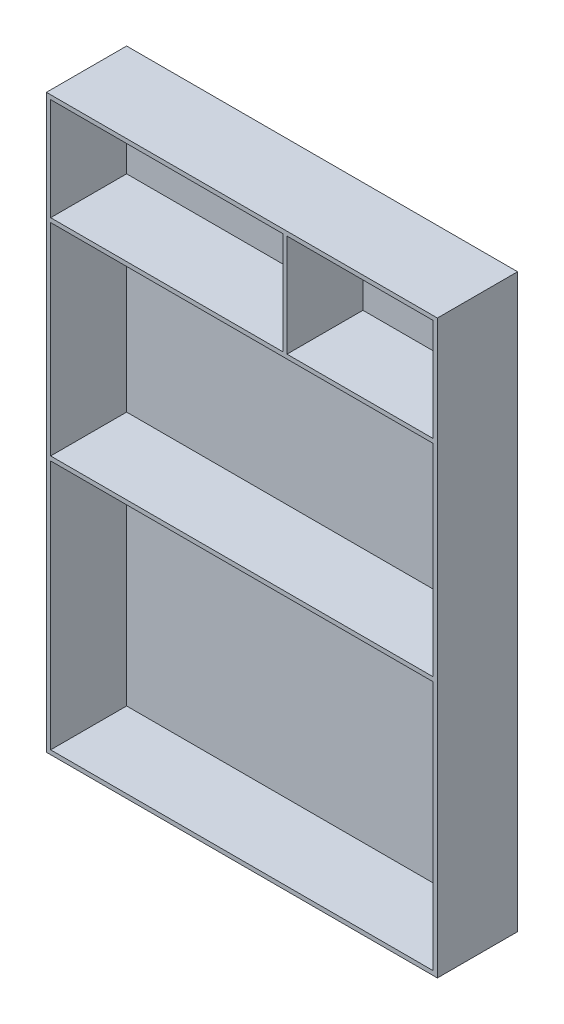
ISO-10303-21;
HEADER;
FILE_DESCRIPTION(('STEP AP214'),'2;1');
FILE_NAME('part.step','',(''),(''),'','','');
FILE_SCHEMA(('AUTOMOTIVE_DESIGN { 1 0 10303 214 1 1 1 1 }'));
ENDSEC;
DATA;
#1=APPLICATION_CONTEXT('core data for automotive mechanical design processes');
#2=APPLICATION_PROTOCOL_DEFINITION('international standard','automotive_design',2000,#1);
#3=PRODUCT_CONTEXT('',#1,'mechanical');
#4=PRODUCT('Part','Part','',(#3));
#5=PRODUCT_RELATED_PRODUCT_CATEGORY('part','',(#4));
#6=PRODUCT_DEFINITION_FORMATION('','',#4);
#7=PRODUCT_DEFINITION_CONTEXT('part definition',#1,'design');
#8=PRODUCT_DEFINITION('design','',#6,#7);
#9=PRODUCT_DEFINITION_SHAPE('','',#8);
#10=(LENGTH_UNIT() NAMED_UNIT(*) SI_UNIT(.MILLI.,.METRE.));
#11=(NAMED_UNIT(*) PLANE_ANGLE_UNIT() SI_UNIT($,.RADIAN.));
#12=(NAMED_UNIT(*) SI_UNIT($,.STERADIAN.) SOLID_ANGLE_UNIT());
#13=UNCERTAINTY_MEASURE_WITH_UNIT(LENGTH_MEASURE(1.E-05),#10,'distance_accuracy_value','');
#14=(GEOMETRIC_REPRESENTATION_CONTEXT(3) GLOBAL_UNCERTAINTY_ASSIGNED_CONTEXT((#13)) GLOBAL_UNIT_ASSIGNED_CONTEXT((#10,
#11,#12)) REPRESENTATION_CONTEXT('',''));
#15=CARTESIAN_POINT('',(0.,0.,0.));
#16=DIRECTION('',(0.,0.,1.));
#17=DIRECTION('',(1.,0.,0.));
#18=AXIS2_PLACEMENT_3D('',#15,#16,#17);
#19=CARTESIAN_POINT('',(135.620852814771,-122.622822103109,45.72));
#20=DIRECTION('',(-1.,0.,0.));
#21=DIRECTION('',(0.,0.,1.));
#22=AXIS2_PLACEMENT_3D('',#19,#20,#21);
#23=PLANE('',#22);
#24=DIRECTION('',(0.,1.,0.));
#25=VECTOR('',#24,1.);
#26=CARTESIAN_POINT('',(135.620852814771,-122.622822103109,0.));
#27=LINE('',#26,#25);
#28=CARTESIAN_POINT('',(135.620852814771,154.74348344851,0.));
#29=VERTEX_POINT('',#28);
#30=CARTESIAN_POINT('',(135.620852814771,216.296497032044,0.));
#31=VERTEX_POINT('',#30);
#32=EDGE_CURVE('E231',#29,#31,#27,.T.);
#33=ORIENTED_EDGE('',*,*,#32,.F.);
#34=DIRECTION('',(0.,0.,-1.));
#35=VECTOR('',#34,1.);
#36=CARTESIAN_POINT('',(135.620852814771,154.74348344851,284.698174658136));
#37=LINE('',#36,#35);
#38=CARTESIAN_POINT('',(135.620852814771,154.74348344851,45.72));
#39=VERTEX_POINT('',#38);
#40=EDGE_CURVE('E217',#39,#29,#37,.T.);
#41=ORIENTED_EDGE('',*,*,#40,.F.);
#42=DIRECTION('',(0.,1.,0.));
#43=VECTOR('',#42,1.);
#44=CARTESIAN_POINT('',(135.620852814771,-122.622822103109,45.72));
#45=LINE('',#44,#43);
#46=CARTESIAN_POINT('',(135.620852814771,216.296497032044,45.72));
#47=VERTEX_POINT('',#46);
#48=EDGE_CURVE('E198',#39,#47,#45,.T.);
#49=ORIENTED_EDGE('',*,*,#48,.T.);
#50=DIRECTION('',(0.,0.,-1.));
#51=VECTOR('',#50,1.);
#52=CARTESIAN_POINT('',(135.620852814771,216.296497032044,45.72));
#53=LINE('',#52,#51);
#54=EDGE_CURVE('E277',#47,#31,#53,.T.);
#55=ORIENTED_EDGE('',*,*,#54,.T.);
#56=EDGE_LOOP('',(#33,#41,#49,#55));
#57=FACE_BOUND('',#56,.T.);
#58=ADVANCED_FACE('F36',(#57),#23,.T.);
#59=CARTESIAN_POINT('',(135.620852814771,30.5575563562701,45.72));
#60=VERTEX_POINT('',#59);
#61=CARTESIAN_POINT('',(135.620852814771,152.20348344851,45.72));
#62=VERTEX_POINT('',#61);
#63=EDGE_CURVE('E246',#60,#62,#45,.T.);
#64=ORIENTED_EDGE('',*,*,#63,.T.);
#65=DIRECTION('',(0.,0.,-1.));
#66=VECTOR('',#65,1.);
#67=CARTESIAN_POINT('',(135.620852814771,152.20348344851,284.698174658136));
#68=LINE('',#67,#66);
#69=CARTESIAN_POINT('',(135.620852814771,152.20348344851,0.));
#70=VERTEX_POINT('',#69);
#71=EDGE_CURVE('E199',#62,#70,#68,.T.);
#72=ORIENTED_EDGE('',*,*,#71,.T.);
#73=CARTESIAN_POINT('',(135.620852814771,30.5575563562701,0.));
#74=VERTEX_POINT('',#73);
#75=EDGE_CURVE('E260',#74,#70,#27,.T.);
#76=ORIENTED_EDGE('',*,*,#75,.F.);
#77=DIRECTION('',(0.,0.,-1.));
#78=VECTOR('',#77,1.);
#79=CARTESIAN_POINT('',(135.620852814771,30.5575563562701,284.698174658136));
#80=LINE('',#79,#78);
#81=EDGE_CURVE('E223',#60,#74,#80,.T.);
#82=ORIENTED_EDGE('',*,*,#81,.F.);
#83=EDGE_LOOP('',(#64,#72,#76,#82));
#84=FACE_BOUND('',#83,.T.);
#85=ADVANCED_FACE('F334',(#84),#23,.T.);
#86=CARTESIAN_POINT('',(-94.6021989691793,-122.622822103109,45.72));
#87=DIRECTION('',(1.,0.,0.));
#88=DIRECTION('',(0.,0.,-1.));
#89=AXIS2_PLACEMENT_3D('',#86,#87,#88);
#90=PLANE('',#89);
#91=DIRECTION('',(0.,-1.,0.));
#92=VECTOR('',#91,1.);
#93=CARTESIAN_POINT('',(-94.6021989691793,-122.622822103109,45.72));
#94=LINE('',#93,#92);
#95=CARTESIAN_POINT('',(-94.6021989691793,216.296497032044,45.72));
#96=VERTEX_POINT('',#95);
#97=CARTESIAN_POINT('',(-94.6021989691793,154.74348344851,45.72));
#98=VERTEX_POINT('',#97);
#99=EDGE_CURVE('E250',#96,#98,#94,.T.);
#100=ORIENTED_EDGE('',*,*,#99,.T.);
#101=DIRECTION('',(0.,0.,-1.));
#102=VECTOR('',#101,1.);
#103=CARTESIAN_POINT('',(-94.6021989691793,154.74348344851,284.698174658136));
#104=LINE('',#103,#102);
#105=CARTESIAN_POINT('',(-94.6021989691793,154.74348344851,0.));
#106=VERTEX_POINT('',#105);
#107=EDGE_CURVE('E212',#98,#106,#104,.T.);
#108=ORIENTED_EDGE('',*,*,#107,.T.);
#109=DIRECTION('',(0.,-1.,0.));
#110=VECTOR('',#109,1.);
#111=CARTESIAN_POINT('',(-94.6021989691793,-122.622822103109,0.));
#112=LINE('',#111,#110);
#113=CARTESIAN_POINT('',(-94.6021989691793,216.296497032044,0.));
#114=VERTEX_POINT('',#113);
#115=EDGE_CURVE('E264',#114,#106,#112,.T.);
#116=ORIENTED_EDGE('',*,*,#115,.F.);
#117=DIRECTION('',(0.,0.,-1.));
#118=VECTOR('',#117,1.);
#119=CARTESIAN_POINT('',(-94.6021989691793,216.296497032044,45.72));
#120=LINE('',#119,#118);
#121=EDGE_CURVE('E274',#96,#114,#120,.T.);
#122=ORIENTED_EDGE('',*,*,#121,.F.);
#123=EDGE_LOOP('',(#100,#108,#116,#122));
#124=FACE_BOUND('',#123,.T.);
#125=ADVANCED_FACE('F341',(#124),#90,.T.);
#126=CARTESIAN_POINT('',(-94.6021989691793,152.20348344851,0.));
#127=VERTEX_POINT('',#126);
#128=CARTESIAN_POINT('',(-94.6021989691793,30.5575563562701,0.));
#129=VERTEX_POINT('',#128);
#130=EDGE_CURVE('E267',#127,#129,#112,.T.);
#131=ORIENTED_EDGE('',*,*,#130,.F.);
#132=DIRECTION('',(0.,0.,-1.));
#133=VECTOR('',#132,1.);
#134=CARTESIAN_POINT('',(-94.6021989691793,152.20348344851,284.698174658136));
#135=LINE('',#134,#133);
#136=CARTESIAN_POINT('',(-94.6021989691793,152.20348344851,45.72));
#137=VERTEX_POINT('',#136);
#138=EDGE_CURVE('E214',#137,#127,#135,.T.);
#139=ORIENTED_EDGE('',*,*,#138,.F.);
#140=CARTESIAN_POINT('',(-94.6021989691793,30.5575563562701,45.72));
#141=VERTEX_POINT('',#140);
#142=EDGE_CURVE('E253',#137,#141,#94,.T.);
#143=ORIENTED_EDGE('',*,*,#142,.T.);
#144=DIRECTION('',(0.,0.,-1.));
#145=VECTOR('',#144,1.);
#146=CARTESIAN_POINT('',(-94.6021989691793,30.5575563562701,284.698174658136));
#147=LINE('',#146,#145);
#148=EDGE_CURVE('E222',#141,#129,#147,.T.);
#149=ORIENTED_EDGE('',*,*,#148,.T.);
#150=EDGE_LOOP('',(#131,#139,#143,#149));
#151=FACE_BOUND('',#150,.T.);
#152=ADVANCED_FACE('F356',(#151),#90,.T.);
#153=CARTESIAN_POINT('',(0.,0.,0.));
#154=DIRECTION('',(0.,0.,1.));
#155=DIRECTION('',(1.,0.,0.));
#156=AXIS2_PLACEMENT_3D('',#153,#154,#155);
#157=PLANE('',#156);
#158=DIRECTION('',(0.,1.,0.));
#159=VECTOR('',#158,1.);
#160=CARTESIAN_POINT('',(47.6378010308207,154.74348344851,0.));
#161=LINE('',#160,#159);
#162=CARTESIAN_POINT('',(47.6378010308207,154.74348344851,0.));
#163=VERTEX_POINT('',#162);
#164=CARTESIAN_POINT('',(47.6378010308207,216.296497032044,0.));
#165=VERTEX_POINT('',#164);
#166=EDGE_CURVE('E53',#163,#165,#161,.T.);
#167=ORIENTED_EDGE('',*,*,#166,.F.);
#168=DIRECTION('',(-1.,0.,0.));
#169=VECTOR('',#168,1.);
#170=CARTESIAN_POINT('',(135.620852814771,154.74348344851,0.));
#171=LINE('',#170,#169);
#172=EDGE_CURVE('E193',#29,#163,#171,.T.);
#173=ORIENTED_EDGE('',*,*,#172,.F.);
#174=ORIENTED_EDGE('',*,*,#32,.T.);
#175=DIRECTION('',(-1.,0.,0.));
#176=VECTOR('',#175,1.);
#177=CARTESIAN_POINT('',(135.620852814771,216.296497032044,0.));
#178=LINE('',#177,#176);
#179=EDGE_CURVE('E261',#31,#165,#178,.T.);
#180=ORIENTED_EDGE('',*,*,#179,.T.);
#181=EDGE_LOOP('',(#167,#173,#174,#180));
#182=FACE_BOUND('',#181,.T.);
#183=ADVANCED_FACE('F417',(#182),#157,.T.);
#184=DIRECTION('',(-1.,0.,0.));
#185=VECTOR('',#184,1.);
#186=CARTESIAN_POINT('',(45.0978010308207,154.74348344851,0.));
#187=LINE('',#186,#185);
#188=CARTESIAN_POINT('',(45.0978010308207,154.74348344851,0.));
#189=VERTEX_POINT('',#188);
#190=EDGE_CURVE('E61',#189,#106,#187,.T.);
#191=ORIENTED_EDGE('',*,*,#190,.F.);
#192=DIRECTION('',(0.,-1.,0.));
#193=VECTOR('',#192,1.);
#194=CARTESIAN_POINT('',(45.0978010308207,216.296497032044,0.));
#195=LINE('',#194,#193);
#196=CARTESIAN_POINT('',(45.0978010308207,216.296497032044,0.));
#197=VERTEX_POINT('',#196);
#198=EDGE_CURVE('E209',#197,#189,#195,.T.);
#199=ORIENTED_EDGE('',*,*,#198,.F.);
#200=EDGE_CURVE('E259',#197,#114,#178,.T.);
#201=ORIENTED_EDGE('',*,*,#200,.T.);
#202=ORIENTED_EDGE('',*,*,#115,.T.);
#203=EDGE_LOOP('',(#191,#199,#201,#202));
#204=FACE_BOUND('',#203,.T.);
#205=ADVANCED_FACE('F411',(#204),#157,.T.);
#206=ORIENTED_EDGE('',*,*,#75,.T.);
#207=DIRECTION('',(1.,0.,0.));
#208=VECTOR('',#207,1.);
#209=CARTESIAN_POINT('',(-84.9187900837198,152.20348344851,0.));
#210=LINE('',#209,#208);
#211=EDGE_CURVE('E201',#127,#70,#210,.T.);
#212=ORIENTED_EDGE('',*,*,#211,.F.);
#213=ORIENTED_EDGE('',*,*,#130,.T.);
#214=DIRECTION('',(-1.,0.,0.));
#215=VECTOR('',#214,1.);
#216=CARTESIAN_POINT('',(-94.6021989691793,30.5575563562701,0.));
#217=LINE('',#216,#215);
#218=EDGE_CURVE('E219',#74,#129,#217,.T.);
#219=ORIENTED_EDGE('',*,*,#218,.F.);
#220=EDGE_LOOP('',(#206,#212,#213,#219));
#221=FACE_BOUND('',#220,.T.);
#222=ADVANCED_FACE('F376',(#221),#157,.T.);
#223=CARTESIAN_POINT('',(135.620852814771,216.296497032044,45.72));
#224=DIRECTION('',(0.,-1.,0.));
#225=DIRECTION('',(1.,0.,0.));
#226=AXIS2_PLACEMENT_3D('',#223,#224,#225);
#227=PLANE('',#226);
#228=DIRECTION('',(-1.,0.,0.));
#229=VECTOR('',#228,1.);
#230=CARTESIAN_POINT('',(135.620852814771,216.296497032044,45.72));
#231=LINE('',#230,#229);
#232=CARTESIAN_POINT('',(47.6378010308207,216.296497032044,45.72));
#233=VERTEX_POINT('',#232);
#234=EDGE_CURVE('E247',#47,#233,#231,.T.);
#235=ORIENTED_EDGE('',*,*,#234,.T.);
#236=DIRECTION('',(0.,0.,-1.));
#237=VECTOR('',#236,1.);
#238=CARTESIAN_POINT('',(47.6378010308207,216.296497032044,284.698174658136));
#239=LINE('',#238,#237);
#240=EDGE_CURVE('E182',#233,#165,#239,.T.);
#241=ORIENTED_EDGE('',*,*,#240,.T.);
#242=ORIENTED_EDGE('',*,*,#179,.F.);
#243=ORIENTED_EDGE('',*,*,#54,.F.);
#244=EDGE_LOOP('',(#235,#241,#242,#243));
#245=FACE_BOUND('',#244,.T.);
#246=ADVANCED_FACE('F357',(#245),#227,.T.);
#247=ORIENTED_EDGE('',*,*,#200,.F.);
#248=DIRECTION('',(0.,0.,-1.));
#249=VECTOR('',#248,1.);
#250=CARTESIAN_POINT('',(45.0978010308207,216.296497032044,284.698174658136));
#251=LINE('',#250,#249);
#252=CARTESIAN_POINT('',(45.0978010308207,216.296497032044,45.72));
#253=VERTEX_POINT('',#252);
#254=EDGE_CURVE('E206',#253,#197,#251,.T.);
#255=ORIENTED_EDGE('',*,*,#254,.F.);
#256=EDGE_CURVE('E245',#253,#96,#231,.T.);
#257=ORIENTED_EDGE('',*,*,#256,.T.);
#258=ORIENTED_EDGE('',*,*,#121,.T.);
#259=EDGE_LOOP('',(#247,#255,#257,#258));
#260=FACE_BOUND('',#259,.T.);
#261=ADVANCED_FACE('F347',(#260),#227,.T.);
#262=CARTESIAN_POINT('',(135.620852814771,-122.622822103109,45.72));
#263=VERTEX_POINT('',#262);
#264=CARTESIAN_POINT('',(135.620852814771,27.9656420980806,45.72));
#265=VERTEX_POINT('',#264);
#266=EDGE_CURVE('E242',#263,#265,#45,.T.);
#267=ORIENTED_EDGE('',*,*,#266,.T.);
#268=DIRECTION('',(0.,0.,-1.));
#269=VECTOR('',#268,1.);
#270=CARTESIAN_POINT('',(135.620852814771,27.9656420980806,284.698174658136));
#271=LINE('',#270,#269);
#272=CARTESIAN_POINT('',(135.620852814771,27.9656420980806,0.));
#273=VERTEX_POINT('',#272);
#274=EDGE_CURVE('E226',#265,#273,#271,.T.);
#275=ORIENTED_EDGE('',*,*,#274,.T.);
#276=CARTESIAN_POINT('',(135.620852814771,-122.622822103109,0.));
#277=VERTEX_POINT('',#276);
#278=EDGE_CURVE('E256',#277,#273,#27,.T.);
#279=ORIENTED_EDGE('',*,*,#278,.F.);
#280=DIRECTION('',(0.,0.,-1.));
#281=VECTOR('',#280,1.);
#282=CARTESIAN_POINT('',(135.620852814771,-122.622822103109,45.72));
#283=LINE('',#282,#281);
#284=EDGE_CURVE('E255',#263,#277,#283,.T.);
#285=ORIENTED_EDGE('',*,*,#284,.F.);
#286=EDGE_LOOP('',(#267,#275,#279,#285));
#287=FACE_BOUND('',#286,.T.);
#288=ADVANCED_FACE('F337',(#287),#23,.T.);
#289=CARTESIAN_POINT('',(-94.6021989691793,27.9656420980806,0.));
#290=VERTEX_POINT('',#289);
#291=CARTESIAN_POINT('',(-94.6021989691793,-122.622822103109,0.));
#292=VERTEX_POINT('',#291);
#293=EDGE_CURVE('E263',#290,#292,#112,.T.);
#294=ORIENTED_EDGE('',*,*,#293,.F.);
#295=DIRECTION('',(0.,0.,-1.));
#296=VECTOR('',#295,1.);
#297=CARTESIAN_POINT('',(-94.6021989691793,27.9656420980806,284.698174658136));
#298=LINE('',#297,#296);
#299=CARTESIAN_POINT('',(-94.6021989691793,27.9656420980806,45.72));
#300=VERTEX_POINT('',#299);
#301=EDGE_CURVE('E227',#300,#290,#298,.T.);
#302=ORIENTED_EDGE('',*,*,#301,.F.);
#303=CARTESIAN_POINT('',(-94.6021989691793,-122.622822103109,45.72));
#304=VERTEX_POINT('',#303);
#305=EDGE_CURVE('E249',#300,#304,#94,.T.);
#306=ORIENTED_EDGE('',*,*,#305,.T.);
#307=DIRECTION('',(0.,0.,-1.));
#308=VECTOR('',#307,1.);
#309=CARTESIAN_POINT('',(-94.6021989691793,-122.622822103109,45.72));
#310=LINE('',#309,#308);
#311=EDGE_CURVE('E271',#304,#292,#310,.T.);
#312=ORIENTED_EDGE('',*,*,#311,.T.);
#313=EDGE_LOOP('',(#294,#302,#306,#312));
#314=FACE_BOUND('',#313,.T.);
#315=ADVANCED_FACE('F346',(#314),#90,.T.);
#316=ORIENTED_EDGE('',*,*,#278,.T.);
#317=DIRECTION('',(1.,0.,0.));
#318=VECTOR('',#317,1.);
#319=CARTESIAN_POINT('',(-94.6021989691793,27.9656420980806,0.));
#320=LINE('',#319,#318);
#321=EDGE_CURVE('E224',#290,#273,#320,.T.);
#322=ORIENTED_EDGE('',*,*,#321,.F.);
#323=ORIENTED_EDGE('',*,*,#293,.T.);
#324=DIRECTION('',(1.,0.,0.));
#325=VECTOR('',#324,1.);
#326=CARTESIAN_POINT('',(135.620852814771,-122.622822103109,0.));
#327=LINE('',#326,#325);
#328=EDGE_CURVE('E266',#292,#277,#327,.T.);
#329=ORIENTED_EDGE('',*,*,#328,.T.);
#330=EDGE_LOOP('',(#316,#322,#323,#329));
#331=FACE_BOUND('',#330,.T.);
#332=ADVANCED_FACE('F353',(#331),#157,.T.);
#333=CARTESIAN_POINT('',(138.160852814771,-122.622822103109,45.72));
#334=DIRECTION('',(-1.,0.,0.));
#335=DIRECTION('',(0.,0.,1.));
#336=AXIS2_PLACEMENT_3D('',#333,#334,#335);
#337=PLANE('',#336);
#338=DIRECTION('',(0.,1.,0.));
#339=VECTOR('',#338,1.);
#340=CARTESIAN_POINT('',(138.160852814771,-122.622822103109,-2.54));
#341=LINE('',#340,#339);
#342=CARTESIAN_POINT('',(138.160852814771,-125.162822103109,-2.54));
#343=VERTEX_POINT('',#342);
#344=CARTESIAN_POINT('',(138.160852814771,218.836497032044,-2.54));
#345=VERTEX_POINT('',#344);
#346=EDGE_CURVE('E280',#343,#345,#341,.T.);
#347=ORIENTED_EDGE('',*,*,#346,.T.);
#348=DIRECTION('',(0.,0.,-1.));
#349=VECTOR('',#348,1.);
#350=CARTESIAN_POINT('',(138.160852814771,218.836497032044,45.72));
#351=LINE('',#350,#349);
#352=CARTESIAN_POINT('',(138.160852814771,218.836497032044,45.72));
#353=VERTEX_POINT('',#352);
#354=EDGE_CURVE('E11',#353,#345,#351,.T.);
#355=ORIENTED_EDGE('',*,*,#354,.F.);
#356=DIRECTION('',(0.,1.,0.));
#357=VECTOR('',#356,1.);
#358=CARTESIAN_POINT('',(138.160852814771,-122.622822103109,45.72));
#359=LINE('',#358,#357);
#360=CARTESIAN_POINT('',(138.160852814771,-125.162822103109,45.72));
#361=VERTEX_POINT('',#360);
#362=EDGE_CURVE('E297',#361,#353,#359,.T.);
#363=ORIENTED_EDGE('',*,*,#362,.F.);
#364=DIRECTION('',(0.,0.,-1.));
#365=VECTOR('',#364,1.);
#366=CARTESIAN_POINT('',(138.160852814771,-125.162822103109,45.72));
#367=LINE('',#366,#365);
#368=EDGE_CURVE('E284',#361,#343,#367,.T.);
#369=ORIENTED_EDGE('',*,*,#368,.T.);
#370=EDGE_LOOP('',(#347,#355,#363,#369));
#371=FACE_BOUND('',#370,.T.);
#372=ADVANCED_FACE('F314',(#371),#337,.F.);
#373=CARTESIAN_POINT('',(135.620852814771,218.836497032044,45.72));
#374=DIRECTION('',(0.,-1.,0.));
#375=DIRECTION('',(1.,0.,0.));
#376=AXIS2_PLACEMENT_3D('',#373,#374,#375);
#377=PLANE('',#376);
#378=DIRECTION('',(-1.,0.,0.));
#379=VECTOR('',#378,1.);
#380=CARTESIAN_POINT('',(135.620852814771,218.836497032044,-2.54));
#381=LINE('',#380,#379);
#382=CARTESIAN_POINT('',(-97.1421989691793,218.836497032044,-2.54));
#383=VERTEX_POINT('',#382);
#384=EDGE_CURVE('E282',#345,#383,#381,.T.);
#385=ORIENTED_EDGE('',*,*,#384,.T.);
#386=DIRECTION('',(0.,0.,-1.));
#387=VECTOR('',#386,1.);
#388=CARTESIAN_POINT('',(-97.1421989691793,218.836497032044,45.72));
#389=LINE('',#388,#387);
#390=CARTESIAN_POINT('',(-97.1421989691793,218.836497032044,45.72));
#391=VERTEX_POINT('',#390);
#392=EDGE_CURVE('E45',#391,#383,#389,.T.);
#393=ORIENTED_EDGE('',*,*,#392,.F.);
#394=DIRECTION('',(-1.,0.,0.));
#395=VECTOR('',#394,1.);
#396=CARTESIAN_POINT('',(135.620852814771,218.836497032044,45.72));
#397=LINE('',#396,#395);
#398=EDGE_CURVE('E300',#353,#391,#397,.T.);
#399=ORIENTED_EDGE('',*,*,#398,.F.);
#400=ORIENTED_EDGE('',*,*,#354,.T.);
#401=EDGE_LOOP('',(#385,#393,#399,#400));
#402=FACE_BOUND('',#401,.T.);
#403=ADVANCED_FACE('F316',(#402),#377,.F.);
#404=CARTESIAN_POINT('',(-97.1421989691793,-122.622822103109,45.72));
#405=DIRECTION('',(1.,0.,0.));
#406=DIRECTION('',(0.,0.,-1.));
#407=AXIS2_PLACEMENT_3D('',#404,#405,#406);
#408=PLANE('',#407);
#409=DIRECTION('',(0.,-1.,0.));
#410=VECTOR('',#409,1.);
#411=CARTESIAN_POINT('',(-97.1421989691793,-122.622822103109,-2.54));
#412=LINE('',#411,#410);
#413=CARTESIAN_POINT('',(-97.1421989691793,-125.162822103109,-2.54));
#414=VERTEX_POINT('',#413);
#415=EDGE_CURVE('E289',#383,#414,#412,.T.);
#416=ORIENTED_EDGE('',*,*,#415,.T.);
#417=DIRECTION('',(0.,0.,-1.));
#418=VECTOR('',#417,1.);
#419=CARTESIAN_POINT('',(-97.1421989691793,-125.162822103109,45.72));
#420=LINE('',#419,#418);
#421=CARTESIAN_POINT('',(-97.1421989691793,-125.162822103109,45.72));
#422=VERTEX_POINT('',#421);
#423=EDGE_CURVE('E287',#422,#414,#420,.T.);
#424=ORIENTED_EDGE('',*,*,#423,.F.);
#425=DIRECTION('',(0.,-1.,0.));
#426=VECTOR('',#425,1.);
#427=CARTESIAN_POINT('',(-97.1421989691793,-122.622822103109,45.72));
#428=LINE('',#427,#426);
#429=EDGE_CURVE('E301',#391,#422,#428,.T.);
#430=ORIENTED_EDGE('',*,*,#429,.F.);
#431=ORIENTED_EDGE('',*,*,#392,.T.);
#432=EDGE_LOOP('',(#416,#424,#430,#431));
#433=FACE_BOUND('',#432,.T.);
#434=ADVANCED_FACE('F320',(#433),#408,.F.);
#435=CARTESIAN_POINT('',(135.620852814771,-125.162822103109,45.72));
#436=DIRECTION('',(0.,1.,0.));
#437=DIRECTION('',(-1.,0.,0.));
#438=AXIS2_PLACEMENT_3D('',#435,#436,#437);
#439=PLANE('',#438);
#440=DIRECTION('',(1.,0.,0.));
#441=VECTOR('',#440,1.);
#442=CARTESIAN_POINT('',(135.620852814771,-125.162822103109,-2.54));
#443=LINE('',#442,#441);
#444=EDGE_CURVE('E293',#414,#343,#443,.T.);
#445=ORIENTED_EDGE('',*,*,#444,.T.);
#446=ORIENTED_EDGE('',*,*,#368,.F.);
#447=DIRECTION('',(1.,0.,0.));
#448=VECTOR('',#447,1.);
#449=CARTESIAN_POINT('',(135.620852814771,-125.162822103109,45.72));
#450=LINE('',#449,#448);
#451=EDGE_CURVE('E40',#422,#361,#450,.T.);
#452=ORIENTED_EDGE('',*,*,#451,.F.);
#453=ORIENTED_EDGE('',*,*,#423,.T.);
#454=EDGE_LOOP('',(#445,#446,#452,#453));
#455=FACE_BOUND('',#454,.T.);
#456=ADVANCED_FACE('F310',(#455),#439,.F.);
#457=CARTESIAN_POINT('',(0.,0.,45.72));
#458=DIRECTION('',(0.,0.,1.));
#459=DIRECTION('',(1.,0.,0.));
#460=AXIS2_PLACEMENT_3D('',#457,#458,#459);
#461=PLANE('',#460);
#462=ORIENTED_EDGE('',*,*,#142,.F.);
#463=DIRECTION('',(1.,0.,0.));
#464=VECTOR('',#463,1.);
#465=CARTESIAN_POINT('',(-84.9187900837198,152.20348344851,45.72));
#466=LINE('',#465,#464);
#467=EDGE_CURVE('E236',#137,#62,#466,.T.);
#468=ORIENTED_EDGE('',*,*,#467,.T.);
#469=ORIENTED_EDGE('',*,*,#63,.F.);
#470=DIRECTION('',(-1.,0.,0.));
#471=VECTOR('',#470,1.);
#472=CARTESIAN_POINT('',(-94.6021989691793,30.5575563562701,45.72));
#473=LINE('',#472,#471);
#474=EDGE_CURVE('E228',#60,#141,#473,.T.);
#475=ORIENTED_EDGE('',*,*,#474,.T.);
#476=EDGE_LOOP('',(#462,#468,#469,#475));
#477=FACE_BOUND('',#476,.T.);
#478=ORIENTED_EDGE('',*,*,#48,.F.);
#479=DIRECTION('',(-1.,0.,0.));
#480=VECTOR('',#479,1.);
#481=CARTESIAN_POINT('',(135.620852814771,154.74348344851,45.72));
#482=LINE('',#481,#480);
#483=CARTESIAN_POINT('',(47.6378010308207,154.74348344851,45.72));
#484=VERTEX_POINT('',#483);
#485=EDGE_CURVE('E187',#39,#484,#482,.T.);
#486=ORIENTED_EDGE('',*,*,#485,.T.);
#487=DIRECTION('',(0.,1.,0.));
#488=VECTOR('',#487,1.);
#489=CARTESIAN_POINT('',(47.6378010308207,154.74348344851,45.72));
#490=LINE('',#489,#488);
#491=EDGE_CURVE('E177',#484,#233,#490,.T.);
#492=ORIENTED_EDGE('',*,*,#491,.T.);
#493=ORIENTED_EDGE('',*,*,#234,.F.);
#494=EDGE_LOOP('',(#478,#486,#492,#493));
#495=FACE_BOUND('',#494,.T.);
#496=DIRECTION('',(-1.,0.,0.));
#497=VECTOR('',#496,1.);
#498=CARTESIAN_POINT('',(45.0978010308207,154.74348344851,45.72));
#499=LINE('',#498,#497);
#500=CARTESIAN_POINT('',(45.0978010308207,154.74348344851,45.72));
#501=VERTEX_POINT('',#500);
#502=EDGE_CURVE('E391',#501,#98,#499,.T.);
#503=ORIENTED_EDGE('',*,*,#502,.T.);
#504=ORIENTED_EDGE('',*,*,#99,.F.);
#505=ORIENTED_EDGE('',*,*,#256,.F.);
#506=DIRECTION('',(0.,-1.,0.));
#507=VECTOR('',#506,1.);
#508=CARTESIAN_POINT('',(45.0978010308207,216.296497032044,45.72));
#509=LINE('',#508,#507);
#510=EDGE_CURVE('E186',#253,#501,#509,.T.);
#511=ORIENTED_EDGE('',*,*,#510,.T.);
#512=EDGE_LOOP('',(#503,#504,#505,#511));
#513=FACE_BOUND('',#512,.T.);
#514=ORIENTED_EDGE('',*,*,#266,.F.);
#515=DIRECTION('',(1.,0.,0.));
#516=VECTOR('',#515,1.);
#517=CARTESIAN_POINT('',(135.620852814771,-122.622822103109,45.72));
#518=LINE('',#517,#516);
#519=EDGE_CURVE('E252',#304,#263,#518,.T.);
#520=ORIENTED_EDGE('',*,*,#519,.F.);
#521=ORIENTED_EDGE('',*,*,#305,.F.);
#522=DIRECTION('',(1.,0.,0.));
#523=VECTOR('',#522,1.);
#524=CARTESIAN_POINT('',(-94.6021989691793,27.9656420980806,45.72));
#525=LINE('',#524,#523);
#526=EDGE_CURVE('E232',#300,#265,#525,.T.);
#527=ORIENTED_EDGE('',*,*,#526,.T.);
#528=EDGE_LOOP('',(#514,#520,#521,#527));
#529=FACE_BOUND('',#528,.T.);
#530=ORIENTED_EDGE('',*,*,#362,.T.);
#531=ORIENTED_EDGE('',*,*,#398,.T.);
#532=ORIENTED_EDGE('',*,*,#429,.T.);
#533=ORIENTED_EDGE('',*,*,#451,.T.);
#534=EDGE_LOOP('',(#530,#531,#532,#533));
#535=FACE_BOUND('',#534,.T.);
#536=ADVANCED_FACE('F196',(#477,#495,#513,#529,#535),#461,.T.);
#537=CARTESIAN_POINT('',(0.,0.,-2.54));
#538=DIRECTION('',(0.,0.,1.));
#539=DIRECTION('',(1.,0.,0.));
#540=AXIS2_PLACEMENT_3D('',#537,#538,#539);
#541=PLANE('',#540);
#542=ORIENTED_EDGE('',*,*,#346,.F.);
#543=ORIENTED_EDGE('',*,*,#444,.F.);
#544=ORIENTED_EDGE('',*,*,#415,.F.);
#545=ORIENTED_EDGE('',*,*,#384,.F.);
#546=EDGE_LOOP('',(#542,#543,#544,#545));
#547=FACE_BOUND('',#546,.T.);
#548=ADVANCED_FACE('F38',(#547),#541,.F.);
#549=CARTESIAN_POINT('',(135.620852814771,-122.622822103109,45.72));
#550=DIRECTION('',(0.,1.,0.));
#551=DIRECTION('',(-1.,0.,0.));
#552=AXIS2_PLACEMENT_3D('',#549,#550,#551);
#553=PLANE('',#552);
#554=ORIENTED_EDGE('',*,*,#328,.F.);
#555=ORIENTED_EDGE('',*,*,#311,.F.);
#556=ORIENTED_EDGE('',*,*,#519,.T.);
#557=ORIENTED_EDGE('',*,*,#284,.T.);
#558=EDGE_LOOP('',(#554,#555,#556,#557));
#559=FACE_BOUND('',#558,.T.);
#560=ADVANCED_FACE('F323',(#559),#553,.T.);
#561=CARTESIAN_POINT('',(-94.6021989691793,27.9656420980806,284.698174658136));
#562=DIRECTION('',(0.,1.,0.));
#563=DIRECTION('',(0.,0.,1.));
#564=AXIS2_PLACEMENT_3D('',#561,#562,#563);
#565=PLANE('',#564);
#566=ORIENTED_EDGE('',*,*,#526,.F.);
#567=ORIENTED_EDGE('',*,*,#301,.T.);
#568=ORIENTED_EDGE('',*,*,#321,.T.);
#569=ORIENTED_EDGE('',*,*,#274,.F.);
#570=EDGE_LOOP('',(#566,#567,#568,#569));
#571=FACE_BOUND('',#570,.T.);
#572=ADVANCED_FACE('F328',(#571),#565,.F.);
#573=CARTESIAN_POINT('',(-94.6021989691793,30.5575563562701,284.698174658136));
#574=DIRECTION('',(0.,-1.,0.));
#575=DIRECTION('',(1.,0.,0.));
#576=AXIS2_PLACEMENT_3D('',#573,#574,#575);
#577=PLANE('',#576);
#578=ORIENTED_EDGE('',*,*,#474,.F.);
#579=ORIENTED_EDGE('',*,*,#81,.T.);
#580=ORIENTED_EDGE('',*,*,#218,.T.);
#581=ORIENTED_EDGE('',*,*,#148,.F.);
#582=EDGE_LOOP('',(#578,#579,#580,#581));
#583=FACE_BOUND('',#582,.T.);
#584=ADVANCED_FACE('F382',(#583),#577,.F.);
#585=CARTESIAN_POINT('',(135.620852814771,154.74348344851,284.698174658136));
#586=DIRECTION('',(0.,-1.,0.));
#587=DIRECTION('',(0.,0.,-1.));
#588=AXIS2_PLACEMENT_3D('',#585,#586,#587);
#589=PLANE('',#588);
#590=ORIENTED_EDGE('',*,*,#485,.F.);
#591=ORIENTED_EDGE('',*,*,#40,.T.);
#592=ORIENTED_EDGE('',*,*,#172,.T.);
#593=DIRECTION('',(0.,0.,-1.));
#594=VECTOR('',#593,1.);
#595=CARTESIAN_POINT('',(47.6378010308207,154.74348344851,284.698174658136));
#596=LINE('',#595,#594);
#597=EDGE_CURVE('E180',#484,#163,#596,.T.);
#598=ORIENTED_EDGE('',*,*,#597,.F.);
#599=EDGE_LOOP('',(#590,#591,#592,#598));
#600=FACE_BOUND('',#599,.T.);
#601=ADVANCED_FACE('F191',(#600),#589,.F.);
#602=CARTESIAN_POINT('',(47.6378010308207,154.74348344851,284.698174658136));
#603=DIRECTION('',(-1.,0.,0.));
#604=DIRECTION('',(0.,0.,1.));
#605=AXIS2_PLACEMENT_3D('',#602,#603,#604);
#606=PLANE('',#605);
#607=ORIENTED_EDGE('',*,*,#491,.F.);
#608=ORIENTED_EDGE('',*,*,#597,.T.);
#609=ORIENTED_EDGE('',*,*,#166,.T.);
#610=ORIENTED_EDGE('',*,*,#240,.F.);
#611=EDGE_LOOP('',(#607,#608,#609,#610));
#612=FACE_BOUND('',#611,.T.);
#613=ADVANCED_FACE('F179',(#612),#606,.F.);
#614=CARTESIAN_POINT('',(45.0978010308207,216.296497032044,284.698174658136));
#615=DIRECTION('',(1.,0.,0.));
#616=DIRECTION('',(0.,1.,0.));
#617=AXIS2_PLACEMENT_3D('',#614,#615,#616);
#618=PLANE('',#617);
#619=ORIENTED_EDGE('',*,*,#510,.F.);
#620=ORIENTED_EDGE('',*,*,#254,.T.);
#621=ORIENTED_EDGE('',*,*,#198,.T.);
#622=DIRECTION('',(0.,0.,-1.));
#623=VECTOR('',#622,1.);
#624=CARTESIAN_POINT('',(45.0978010308207,154.74348344851,284.698174658136));
#625=LINE('',#624,#623);
#626=EDGE_CURVE('E210',#501,#189,#625,.T.);
#627=ORIENTED_EDGE('',*,*,#626,.F.);
#628=EDGE_LOOP('',(#619,#620,#621,#627));
#629=FACE_BOUND('',#628,.T.);
#630=ADVANCED_FACE('F403',(#629),#618,.F.);
#631=CARTESIAN_POINT('',(45.0978010308207,154.74348344851,284.698174658136));
#632=DIRECTION('',(0.,-1.,0.));
#633=DIRECTION('',(0.,0.,-1.));
#634=AXIS2_PLACEMENT_3D('',#631,#632,#633);
#635=PLANE('',#634);
#636=ORIENTED_EDGE('',*,*,#502,.F.);
#637=ORIENTED_EDGE('',*,*,#626,.T.);
#638=ORIENTED_EDGE('',*,*,#190,.T.);
#639=ORIENTED_EDGE('',*,*,#107,.F.);
#640=EDGE_LOOP('',(#636,#637,#638,#639));
#641=FACE_BOUND('',#640,.T.);
#642=ADVANCED_FACE('F406',(#641),#635,.F.);
#643=CARTESIAN_POINT('',(-84.9187900837198,152.20348344851,284.698174658136));
#644=DIRECTION('',(0.,1.,0.));
#645=DIRECTION('',(-1.,0.,0.));
#646=AXIS2_PLACEMENT_3D('',#643,#644,#645);
#647=PLANE('',#646);
#648=ORIENTED_EDGE('',*,*,#467,.F.);
#649=ORIENTED_EDGE('',*,*,#138,.T.);
#650=ORIENTED_EDGE('',*,*,#211,.T.);
#651=ORIENTED_EDGE('',*,*,#71,.F.);
#652=EDGE_LOOP('',(#648,#649,#650,#651));
#653=FACE_BOUND('',#652,.T.);
#654=ADVANCED_FACE('F390',(#653),#647,.F.);
#655=CLOSED_SHELL('',(#58,#85,#125,#152,#183,#205,#222,#246,#261,#288,#315,#332,#372,#403,#434,
#456,#536,#548,#560,#572,#584,#601,#613,#630,#642,#654));
#656=MANIFOLD_SOLID_BREP('B2',#655);
#657=ADVANCED_BREP_SHAPE_REPRESENTATION('',(#18,#656),#14);
#658=SHAPE_DEFINITION_REPRESENTATION(#9,#657);
ENDSEC;
END-ISO-10303-21;
